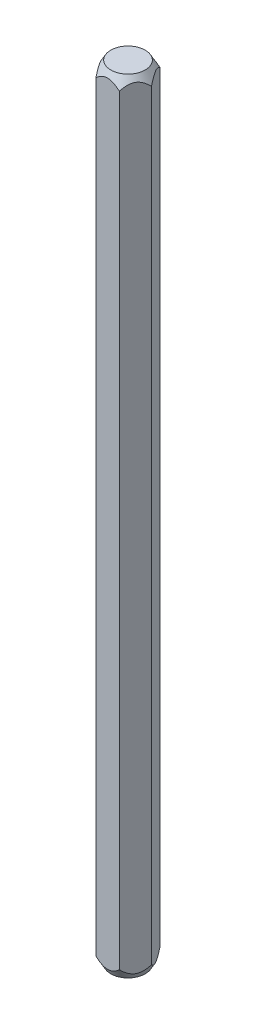
ISO-10303-21;
HEADER;
FILE_DESCRIPTION(('STEP AP214'),'2;1');
FILE_NAME('part.step','',(''),(''),'','','');
FILE_SCHEMA(('AUTOMOTIVE_DESIGN { 1 0 10303 214 1 1 1 1 }'));
ENDSEC;
DATA;
#1=APPLICATION_CONTEXT('core data for automotive mechanical design processes');
#2=APPLICATION_PROTOCOL_DEFINITION('international standard','automotive_design',2000,#1);
#3=PRODUCT_CONTEXT('',#1,'mechanical');
#4=PRODUCT('Part','Part','',(#3));
#5=PRODUCT_RELATED_PRODUCT_CATEGORY('part','',(#4));
#6=PRODUCT_DEFINITION_FORMATION('','',#4);
#7=PRODUCT_DEFINITION_CONTEXT('part definition',#1,'design');
#8=PRODUCT_DEFINITION('design','',#6,#7);
#9=PRODUCT_DEFINITION_SHAPE('','',#8);
#10=(LENGTH_UNIT() NAMED_UNIT(*) SI_UNIT(.MILLI.,.METRE.));
#11=(NAMED_UNIT(*) PLANE_ANGLE_UNIT() SI_UNIT($,.RADIAN.));
#12=(NAMED_UNIT(*) SI_UNIT($,.STERADIAN.) SOLID_ANGLE_UNIT());
#13=UNCERTAINTY_MEASURE_WITH_UNIT(LENGTH_MEASURE(1.E-05),#10,'distance_accuracy_value','');
#14=(GEOMETRIC_REPRESENTATION_CONTEXT(3) GLOBAL_UNCERTAINTY_ASSIGNED_CONTEXT((#13)) GLOBAL_UNIT_ASSIGNED_CONTEXT((#10,
#11,#12)) REPRESENTATION_CONTEXT('',''));
#15=CARTESIAN_POINT('',(0.,0.,0.));
#16=DIRECTION('',(0.,0.,1.));
#17=DIRECTION('',(1.,0.,0.));
#18=AXIS2_PLACEMENT_3D('',#15,#16,#17);
#19=CARTESIAN_POINT('',(0.,-25.,0.));
#20=DIRECTION('',(0.,1.,0.));
#21=DIRECTION('',(0.,0.,1.));
#22=AXIS2_PLACEMENT_3D('',#19,#20,#21);
#23=PLANE('',#22);
#24=CARTESIAN_POINT('',(0.,-25.,0.));
#25=DIRECTION('',(0.,-1.,0.));
#26=DIRECTION('',(0.,0.,-1.));
#27=AXIS2_PLACEMENT_3D('',#24,#25,#26);
#28=CIRCLE('',#27,1.1);
#29=CARTESIAN_POINT('',(0.,-25.,-1.1));
#30=VERTEX_POINT('',#29);
#31=EDGE_CURVE('E211',#30,#30,#28,.T.);
#32=ORIENTED_EDGE('',*,*,#31,.T.);
#33=EDGE_LOOP('',(#32));
#34=FACE_BOUND('',#33,.T.);
#35=ADVANCED_FACE('F35',(#34),#23,.F.);
#36=CARTESIAN_POINT('',(0.,-24.3,0.));
#37=DIRECTION('',(0.,1.,0.));
#38=DIRECTION('',(0.,0.,1.));
#39=AXIS2_PLACEMENT_3D('',#36,#37,#38);
#40=CONICAL_SURFACE('',#39,1.5,0.519146114246527);
#41=ORIENTED_EDGE('',*,*,#31,.F.);
#42=EDGE_LOOP('',(#41));
#43=FACE_BOUND('',#42,.T.);
#44=CARTESIAN_POINT('',(-2.07253485495864,-22.6445054642753,1.29903810567668));
#45=CARTESIAN_POINT('',(-2.03538623793567,-22.6995854387625,1.29903810567668));
#46=CARTESIAN_POINT('',(-1.99804778135318,-22.7545379106194,1.29903810567668));
#47=CARTESIAN_POINT('',(-1.92291943767535,-22.8641377250613,1.29903810567668));
#48=CARTESIAN_POINT('',(-1.88512952568831,-22.9187850505755,1.29903810567668));
#49=CARTESIAN_POINT('',(-1.77082429318834,-23.0824095365471,1.29903810567668));
#50=CARTESIAN_POINT('',(-1.6935260653681,-23.190841663383,1.29903810567667));
#51=CARTESIAN_POINT('',(-1.53196552591618,-23.4111605751849,1.29903810567667));
#52=CARTESIAN_POINT('',(-1.44754976557091,-23.5229362538769,1.29903810567667));
#53=CARTESIAN_POINT('',(-1.31736248949666,-23.687707759074,1.29903810567667));
#54=CARTESIAN_POINT('',(-1.27339385596722,-23.7421251999243,1.29903810567667));
#55=CARTESIAN_POINT('',(-1.18394248532173,-23.8496971859777,1.29903810567667));
#56=CARTESIAN_POINT('',(-1.13845992720304,-23.9028518792159,1.29903810567667));
#57=CARTESIAN_POINT('',(-1.0460663037322,-24.0068956974134,1.29903810567667));
#58=CARTESIAN_POINT('',(-0.999175897510064,-24.0578030562562,1.29903810567667));
#59=CARTESIAN_POINT('',(-0.902905518082995,-24.1573290918742,1.29903810567667));
#60=CARTESIAN_POINT('',(-0.853523188312272,-24.2059455148546,1.29903810567667));
#61=CARTESIAN_POINT('',(-0.752132260774167,-24.2992068812944,1.29903810567666));
#62=CARTESIAN_POINT('',(-0.700159699118802,-24.3438905358105,1.29903810567666));
#63=CARTESIAN_POINT('',(-0.59219859081294,-24.42803583742,1.29903810567666));
#64=CARTESIAN_POINT('',(-0.536218911719424,-24.4675084969099,1.29903810567666));
#65=CARTESIAN_POINT('',(-0.433498084070144,-24.5295405301596,1.29903810567666));
#66=CARTESIAN_POINT('',(-0.387849628266959,-24.5538748512374,1.29903810567666));
#67=CARTESIAN_POINT('',(-0.293526604004851,-24.5957302033474,1.29903810567666));
#68=CARTESIAN_POINT('',(-0.244858958002789,-24.613266197404,1.29903810567666));
#69=CARTESIAN_POINT('',(-0.153193150401338,-24.6370694717298,1.29903810567666));
#70=CARTESIAN_POINT('',(-0.110559843935742,-24.6447054155175,1.29903810567666));
#71=CARTESIAN_POINT('',(-0.0245950358367228,-24.6525133256309,1.29903810567666));
#72=CARTESIAN_POINT('',(0.0187362836021545,-24.6526872090989,1.29903810567666));
#73=CARTESIAN_POINT('',(0.104675897111497,-24.6455528412023,1.29903810567666));
#74=CARTESIAN_POINT('',(0.147285340581522,-24.6382579036111,1.29903810567666));
#75=CARTESIAN_POINT('',(0.230844394471178,-24.6172064684648,1.29903810567665));
#76=CARTESIAN_POINT('',(0.271792683893707,-24.6034449338227,1.29903810567665));
#77=CARTESIAN_POINT('',(0.379155683060809,-24.5596243102184,1.29903810567665));
#78=CARTESIAN_POINT('',(0.443632811839528,-24.524872986136,1.29903810567665));
#79=CARTESIAN_POINT('',(0.53609349528473,-24.4662230265959,1.29903810567665));
#80=CARTESIAN_POINT('',(0.566280834868065,-24.4455205799594,1.29903810567665));
#81=CARTESIAN_POINT('',(0.62539579604866,-24.4023888180353,1.29903810567665));
#82=CARTESIAN_POINT('',(0.654323878891216,-24.3799601435129,1.29903810567665));
#83=CARTESIAN_POINT('',(0.73164626055736,-24.3170177665695,1.29903810567665));
#84=CARTESIAN_POINT('',(0.778952826746308,-24.2751785470326,1.29903810567665));
#85=CARTESIAN_POINT('',(0.871034974400621,-24.1887832099594,1.29903810567665));
#86=CARTESIAN_POINT('',(0.915808803866991,-24.1442252549995,1.29903810567665));
#87=CARTESIAN_POINT('',(1.0034519171813,-24.0530954920219,1.29903810567665));
#88=CARTESIAN_POINT('',(1.04631674732251,-24.0065194285746,1.29903810567665));
#89=CARTESIAN_POINT('',(1.13045799987154,-23.9119490096584,1.29903810567665));
#90=CARTESIAN_POINT('',(1.17173414809037,-23.8639544118707,1.29903810567664));
#91=CARTESIAN_POINT('',(1.29402411346603,-23.7179577797709,1.29903810567664));
#92=CARTESIAN_POINT('',(1.37311876688962,-23.6183520364851,1.29903810567664));
#93=CARTESIAN_POINT('',(1.52779498622432,-23.4166840738683,1.29903810567664));
#94=CARTESIAN_POINT('',(1.60338079775172,-23.3146250626919,1.29903810567664));
#95=CARTESIAN_POINT('',(1.74551356738805,-23.1179594614914,1.29903810567664));
#96=CARTESIAN_POINT('',(1.81226533710323,-23.0235002712326,1.29903810567664));
#97=CARTESIAN_POINT('',(1.94369038410247,-22.8343046189558,1.29903810567664));
#98=CARTESIAN_POINT('',(2.00837631113091,-22.739576959479,1.29903810567664));
#99=CARTESIAN_POINT('',(2.07253485495868,-22.6445054642753,1.29903810567664));
#100=B_SPLINE_CURVE_WITH_KNOTS('',3,(#44,#45,#46,#47,#48,#49,#50,#51,#52,#53,#54,#55,#56,#57,
#58,#59,#60,#61,#62,#63,#64,#65,#66,#67,#68,#69,#70,#71,#72,#73,#74,#75,#76,#77,#78,#79,#80,#81,
#82,#83,#84,#85,#86,#87,#88,#89,#90,#91,#92,#93,#94,#95,#96,#97,#98,#99),.UNSPECIFIED.,.F.,.F.,
(4,2,2,2,2,2,2,2,2,2,2,2,2,2,2,2,2,2,2,2,2,2,2,2,2,2,2,4),(0.,0.199309941791665,
0.398630924034157,0.798094667911542,1.21820476163974,1.42806663426301,1.63790378160688,
1.84548111764697,2.05325857539453,2.25868516950043,2.46367043823924,2.6184799554092,
2.77294677782484,2.90229727841163,3.03161454624823,3.16070169633709,3.28988956459301,
3.50827500154843,3.61806680102765,3.72781804122222,3.91711654272997,4.10654442762105,
4.29639328838323,4.48627476936936,4.86771182519662,5.24867463357983,5.59565170158738,
5.93975000862931),.UNSPECIFIED.);
#101=CARTESIAN_POINT('',(-0.749999999999994,-24.3,1.29903810567666));
#102=VERTEX_POINT('',#101);
#103=CARTESIAN_POINT('',(0.750000000000015,-24.3,1.29903810567665));
#104=VERTEX_POINT('',#103);
#105=EDGE_CURVE('E205',#102,#104,#100,.T.);
#106=ORIENTED_EDGE('',*,*,#105,.F.);
#107=CARTESIAN_POINT('',(-1.50011427265704,-24.2998,-0.000197926047904945));
#108=CARTESIAN_POINT('',(-1.48445603297541,-24.327174757968,0.0269229406377818));
#109=CARTESIAN_POINT('',(-1.46848195449817,-24.3538800893295,0.0545908561644444));
#110=CARTESIAN_POINT('',(-1.43569548405084,-24.4055169111973,0.111378688780077));
#111=CARTESIAN_POINT('',(-1.41887901814408,-24.4304380044115,0.140505662134338));
#112=CARTESIAN_POINT('',(-1.38391500160077,-24.4783836425917,0.201065115224024));
#113=CARTESIAN_POINT('',(-1.36574408969252,-24.5013411744891,0.232538057868973));
#114=CARTESIAN_POINT('',(-1.32841093508815,-24.5436117266531,0.297200978450562));
#115=CARTESIAN_POINT('',(-1.30925105807725,-24.5629329732754,0.330386858900204));
#116=CARTESIAN_POINT('',(-1.26838798330661,-24.5980525589006,0.401163780556439));
#117=CARTESIAN_POINT('',(-1.24660186054835,-24.6134770395848,0.438898452073686));
#118=CARTESIAN_POINT('',(-1.20221357157386,-24.6369483088712,0.515781223838545));
#119=CARTESIAN_POINT('',(-1.17961959829794,-24.6450547788082,0.554915133497288));
#120=CARTESIAN_POINT('',(-1.13384224962676,-24.6528895799723,0.634203827231579));
#121=CARTESIAN_POINT('',(-1.11065535633217,-24.6525397632328,0.674364704487471));
#122=CARTESIAN_POINT('',(-1.06467286203397,-24.6433215388631,0.754008720870708));
#123=CARTESIAN_POINT('',(-1.04187839232794,-24.6344317002164,0.793489900533146));
#124=CARTESIAN_POINT('',(-0.991146983129713,-24.6060006684914,0.881359278804033));
#125=CARTESIAN_POINT('',(-0.963537845666472,-24.5841886627298,0.92917970764352));
#126=CARTESIAN_POINT('',(-0.910253599849041,-24.5323504473517,1.0214707286423));
#127=CARTESIAN_POINT('',(-0.884588776237871,-24.5022839857869,1.06592350710414));
#128=CARTESIAN_POINT('',(-0.840391512775697,-24.443815750008,1.14247541297613));
#129=CARTESIAN_POINT('',(-0.821509551399777,-24.4164389030966,1.17517992942577));
#130=CARTESIAN_POINT('',(-0.784926482622607,-24.3595575952382,1.23854366324462));
#131=CARTESIAN_POINT('',(-0.767213792789505,-24.3300831132095,1.26922294197426));
#132=CARTESIAN_POINT('',(-0.749885727342727,-24.2997999999996,1.29923603172496));
#133=B_SPLINE_CURVE_WITH_KNOTS('',3,(#107,#108,#109,#110,#111,#112,#113,#114,#115,#116,#117,
#118,#119,#120,#121,#122,#123,#124,#125,#126,#127,#128,#129,#130,#131,#132),.UNSPECIFIED.,.F.,
.F.,(4,2,2,2,2,2,2,2,2,2,2,2,4),(0.,0.124825594013029,0.250327656131253,0.379126359053951,
0.507630083264508,0.645790755097725,0.782814215772803,0.921104445712337,1.05974262128002,
1.23684404007381,1.41482490290692,1.5546504669262,1.69277279754433),.UNSPECIFIED.);
#134=CARTESIAN_POINT('',(-1.5,-24.3,0.));
#135=VERTEX_POINT('',#134);
#136=EDGE_CURVE('E207',#135,#102,#133,.T.);
#137=ORIENTED_EDGE('',*,*,#136,.F.);
#138=CARTESIAN_POINT('',(-0.749885727342744,-24.2997999999996,-1.29923603172495));
#139=CARTESIAN_POINT('',(-0.765543967024381,-24.3271747579676,-1.27211516503926));
#140=CARTESIAN_POINT('',(-0.781518045501614,-24.3538800893291,-1.2444472495126));
#141=CARTESIAN_POINT('',(-0.814304515948942,-24.405516911197,-1.18765941689697));
#142=CARTESIAN_POINT('',(-0.831120981855702,-24.4304380044111,-1.15853244354271));
#143=CARTESIAN_POINT('',(-0.866084998399005,-24.4783836425914,-1.09797299045303));
#144=CARTESIAN_POINT('',(-0.884255910307254,-24.5013411744888,-1.06650004780809));
#145=CARTESIAN_POINT('',(-0.921589064911617,-24.5436117266528,-1.00183712722651));
#146=CARTESIAN_POINT('',(-0.94074894192251,-24.5629329732752,-0.968651246776868));
#147=CARTESIAN_POINT('',(-0.981612016693148,-24.5980525589004,-0.897874325120636));
#148=CARTESIAN_POINT('',(-1.00339813945141,-24.6134770395847,-0.860139653603387));
#149=CARTESIAN_POINT('',(-1.0477864284259,-24.6369483088711,-0.783256881838522));
#150=CARTESIAN_POINT('',(-1.07038040170182,-24.6450547788082,-0.744122972179774));
#151=CARTESIAN_POINT('',(-1.11615775037302,-24.6528895799723,-0.664834278445467));
#152=CARTESIAN_POINT('',(-1.1393446436676,-24.6525397632328,-0.624673401189564));
#153=CARTESIAN_POINT('',(-1.18532713796582,-24.6433215388632,-0.545029384806302));
#154=CARTESIAN_POINT('',(-1.20812160767186,-24.6344317002165,-0.50554820514385));
#155=CARTESIAN_POINT('',(-1.25885301687008,-24.6060006684915,-0.417678826872974));
#156=CARTESIAN_POINT('',(-1.28646215433331,-24.58418866273,-0.369858398033512));
#157=CARTESIAN_POINT('',(-1.33974640015071,-24.532350447352,-0.277567377034775));
#158=CARTESIAN_POINT('',(-1.36541122376187,-24.5022839857872,-0.233114598572955));
#159=CARTESIAN_POINT('',(-1.40960848722404,-24.4438157500083,-0.156562692700968));
#160=CARTESIAN_POINT('',(-1.42849044859997,-24.4164389030969,-0.123858176251308));
#161=CARTESIAN_POINT('',(-1.46507351737715,-24.3595575952386,-0.0604944424324382));
#162=CARTESIAN_POINT('',(-1.48278620721026,-24.3300831132099,-0.0298151637027841));
#163=CARTESIAN_POINT('',(-1.50011427265704,-24.2998,0.000197926047925716));
#164=B_SPLINE_CURVE_WITH_KNOTS('',3,(#138,#139,#140,#141,#142,#143,#144,#145,#146,#147,#148,
#149,#150,#151,#152,#153,#154,#155,#156,#157,#158,#159,#160,#161,#162,#163),.UNSPECIFIED.,.F.,
.F.,(4,2,2,2,2,2,2,2,2,2,2,2,4),(0.,0.124825594013047,0.250327656131286,0.379126359054,
0.507630083264569,0.645790755097817,0.782814215772925,0.921104445712495,1.05974262128021,
1.23684404007388,1.41482490290687,1.55465046692618,1.69277279754433),.UNSPECIFIED.);
#165=CARTESIAN_POINT('',(-0.750000000000003,-24.3,-1.29903810567666));
#166=VERTEX_POINT('',#165);
#167=EDGE_CURVE('E92',#166,#135,#164,.T.);
#168=ORIENTED_EDGE('',*,*,#167,.F.);
#169=CARTESIAN_POINT('',(2.07253485495865,-22.6445054642753,-1.29903810567666));
#170=CARTESIAN_POINT('',(2.03538623793567,-22.6995854387625,-1.29903810567666));
#171=CARTESIAN_POINT('',(1.99804778135319,-22.7545379106194,-1.29903810567666));
#172=CARTESIAN_POINT('',(1.92291943767536,-22.8641377250613,-1.29903810567666));
#173=CARTESIAN_POINT('',(1.88512952568832,-22.9187850505755,-1.29903810567666));
#174=CARTESIAN_POINT('',(1.77082429318835,-23.0824095365471,-1.29903810567666));
#175=CARTESIAN_POINT('',(1.69352606536811,-23.190841663383,-1.29903810567666));
#176=CARTESIAN_POINT('',(1.53196552591619,-23.4111605751849,-1.29903810567666));
#177=CARTESIAN_POINT('',(1.44754976557092,-23.5229362538769,-1.29903810567666));
#178=CARTESIAN_POINT('',(1.31736248949667,-23.687707759074,-1.29903810567666));
#179=CARTESIAN_POINT('',(1.27339385596723,-23.7421251999243,-1.29903810567666));
#180=CARTESIAN_POINT('',(1.18394248532174,-23.8496971859777,-1.29903810567666));
#181=CARTESIAN_POINT('',(1.13845992720305,-23.9028518792159,-1.29903810567666));
#182=CARTESIAN_POINT('',(1.0460663037322,-24.0068956974134,-1.29903810567666));
#183=CARTESIAN_POINT('',(0.999175897510073,-24.0578030562562,-1.29903810567666));
#184=CARTESIAN_POINT('',(0.902905518083004,-24.1573290918742,-1.29903810567666));
#185=CARTESIAN_POINT('',(0.853523188312281,-24.2059455148546,-1.29903810567666));
#186=CARTESIAN_POINT('',(0.752132260774175,-24.2992068812944,-1.29903810567666));
#187=CARTESIAN_POINT('',(0.70015969911881,-24.3438905358105,-1.29903810567666));
#188=CARTESIAN_POINT('',(0.592198590812948,-24.42803583742,-1.29903810567666));
#189=CARTESIAN_POINT('',(0.536218911719433,-24.4675084969099,-1.29903810567666));
#190=CARTESIAN_POINT('',(0.433498084070153,-24.5295405301596,-1.29903810567666));
#191=CARTESIAN_POINT('',(0.387849628266967,-24.5538748512374,-1.29903810567666));
#192=CARTESIAN_POINT('',(0.29352660400486,-24.5957302033474,-1.29903810567666));
#193=CARTESIAN_POINT('',(0.244858958002798,-24.613266197404,-1.29903810567666));
#194=CARTESIAN_POINT('',(0.153193150401347,-24.6370694717298,-1.29903810567666));
#195=CARTESIAN_POINT('',(0.110559843935751,-24.6447054155175,-1.29903810567666));
#196=CARTESIAN_POINT('',(0.0245950358367311,-24.6525133256309,-1.29903810567666));
#197=CARTESIAN_POINT('',(-0.0187362836021461,-24.6526872090989,-1.29903810567666));
#198=CARTESIAN_POINT('',(-0.104675897111489,-24.6455528412023,-1.29903810567666));
#199=CARTESIAN_POINT('',(-0.147285340581513,-24.6382579036111,-1.29903810567666));
#200=CARTESIAN_POINT('',(-0.230844394471169,-24.6172064684648,-1.29903810567666));
#201=CARTESIAN_POINT('',(-0.271792683893698,-24.6034449338227,-1.29903810567666));
#202=CARTESIAN_POINT('',(-0.3791556830608,-24.5596243102184,-1.29903810567666));
#203=CARTESIAN_POINT('',(-0.443632811839519,-24.524872986136,-1.29903810567666));
#204=CARTESIAN_POINT('',(-0.53609349528472,-24.4662230265959,-1.29903810567666));
#205=CARTESIAN_POINT('',(-0.566280834868054,-24.4455205799594,-1.29903810567666));
#206=CARTESIAN_POINT('',(-0.625395796048651,-24.4023888180353,-1.29903810567665));
#207=CARTESIAN_POINT('',(-0.654323878891209,-24.3799601435129,-1.29903810567665));
#208=CARTESIAN_POINT('',(-0.731646260557356,-24.3170177665695,-1.29903810567665));
#209=CARTESIAN_POINT('',(-0.778952826746304,-24.2751785470326,-1.29903810567665));
#210=CARTESIAN_POINT('',(-0.871034974400618,-24.1887832099594,-1.29903810567665));
#211=CARTESIAN_POINT('',(-0.915808803866988,-24.1442252549995,-1.29903810567665));
#212=CARTESIAN_POINT('',(-1.00345191718129,-24.0530954920219,-1.29903810567665));
#213=CARTESIAN_POINT('',(-1.04631674732251,-24.0065194285746,-1.29903810567665));
#214=CARTESIAN_POINT('',(-1.13045799987154,-23.9119490096584,-1.29903810567665));
#215=CARTESIAN_POINT('',(-1.17173414809037,-23.8639544118706,-1.29903810567665));
#216=CARTESIAN_POINT('',(-1.29402411346603,-23.7179577797709,-1.29903810567665));
#217=CARTESIAN_POINT('',(-1.37311876688962,-23.6183520364851,-1.29903810567665));
#218=CARTESIAN_POINT('',(-1.52779498622432,-23.4166840738683,-1.29903810567665));
#219=CARTESIAN_POINT('',(-1.60338079775172,-23.3146250626919,-1.29903810567665));
#220=CARTESIAN_POINT('',(-1.74551356738804,-23.1179594614914,-1.29903810567665));
#221=CARTESIAN_POINT('',(-1.81226533710322,-23.0235002712326,-1.29903810567665));
#222=CARTESIAN_POINT('',(-1.94369038410245,-22.8343046189558,-1.29903810567665));
#223=CARTESIAN_POINT('',(-2.00837631113089,-22.7395769594791,-1.29903810567665));
#224=CARTESIAN_POINT('',(-2.07253485495866,-22.6445054642753,-1.29903810567665));
#225=B_SPLINE_CURVE_WITH_KNOTS('',3,(#169,#170,#171,#172,#173,#174,#175,#176,#177,#178,#179,
#180,#181,#182,#183,#184,#185,#186,#187,#188,#189,#190,#191,#192,#193,#194,#195,#196,#197,#198,
#199,#200,#201,#202,#203,#204,#205,#206,#207,#208,#209,#210,#211,#212,#213,#214,#215,#216,#217,
#218,#219,#220,#221,#222,#223,#224),.UNSPECIFIED.,.F.,.F.,(4,2,2,2,2,2,2,2,2,2,2,2,2,2,2,2,2,2,
2,2,2,2,2,2,2,2,2,4),(0.,0.199309941791666,0.398630924034157,0.798094667911542,1.21820476163974,
1.42806663426301,1.63790378160688,1.84548111764697,2.05325857539453,2.25868516950043,
2.46367043823924,2.6184799554092,2.77294677782484,2.90229727841163,3.03161454624823,
3.16070169633709,3.28988956459301,3.50827500154843,3.61806680102765,3.72781804122222,
3.91711654272998,4.10654442762106,4.29639328838324,4.48627476936937,4.86771182519663,
5.24867463357984,5.59565170158737,5.93975000862928),.UNSPECIFIED.);
#226=CARTESIAN_POINT('',(0.750000000000003,-24.3,-1.29903810567666));
#227=VERTEX_POINT('',#226);
#228=EDGE_CURVE('E87',#227,#166,#225,.T.);
#229=ORIENTED_EDGE('',*,*,#228,.F.);
#230=CARTESIAN_POINT('',(1.50011427265704,-24.2998,0.000197926047915423));
#231=CARTESIAN_POINT('',(1.48445603297541,-24.327174757968,-0.0269229406377714));
#232=CARTESIAN_POINT('',(1.46848195449817,-24.3538800893295,-0.0545908561644341));
#233=CARTESIAN_POINT('',(1.43569548405084,-24.4055169111973,-0.111378688780067));
#234=CARTESIAN_POINT('',(1.41887901814408,-24.4304380044115,-0.140505662134329));
#235=CARTESIAN_POINT('',(1.38391500160077,-24.4783836425917,-0.201065115224014));
#236=CARTESIAN_POINT('',(1.36574408969252,-24.5013411744891,-0.232538057868963));
#237=CARTESIAN_POINT('',(1.32841093508815,-24.5436117266531,-0.297200978450553));
#238=CARTESIAN_POINT('',(1.30925105807726,-24.5629329732754,-0.330386858900195));
#239=CARTESIAN_POINT('',(1.26838798330662,-24.5980525589006,-0.40116378055643));
#240=CARTESIAN_POINT('',(1.24660186054835,-24.6134770395848,-0.438898452073677));
#241=CARTESIAN_POINT('',(1.20221357157387,-24.6369483088712,-0.515781223838537));
#242=CARTESIAN_POINT('',(1.17961959829795,-24.6450547788082,-0.55491513349728));
#243=CARTESIAN_POINT('',(1.13384224962676,-24.6528895799723,-0.634203827231572));
#244=CARTESIAN_POINT('',(1.11065535633218,-24.6525397632328,-0.674364704487464));
#245=CARTESIAN_POINT('',(1.06467286203397,-24.6433215388631,-0.754008720870701));
#246=CARTESIAN_POINT('',(1.04187839232794,-24.6344317002164,-0.793489900533139));
#247=CARTESIAN_POINT('',(0.991146983129719,-24.6060006684914,-0.881359278804028));
#248=CARTESIAN_POINT('',(0.963537845666477,-24.5841886627298,-0.929179707643515));
#249=CARTESIAN_POINT('',(0.910253599849047,-24.5323504473517,-1.02147072864229));
#250=CARTESIAN_POINT('',(0.884588776237878,-24.5022839857869,-1.06592350710413));
#251=CARTESIAN_POINT('',(0.840391512775705,-24.443815750008,-1.14247541297612));
#252=CARTESIAN_POINT('',(0.821509551399785,-24.4164389030966,-1.17517992942577));
#253=CARTESIAN_POINT('',(0.784926482622615,-24.3595575952382,-1.23854366324461));
#254=CARTESIAN_POINT('',(0.767213792789512,-24.3300831132095,-1.26922294197426));
#255=CARTESIAN_POINT('',(0.749885727342735,-24.2997999999996,-1.29923603172495));
#256=B_SPLINE_CURVE_WITH_KNOTS('',3,(#230,#231,#232,#233,#234,#235,#236,#237,#238,#239,#240,
#241,#242,#243,#244,#245,#246,#247,#248,#249,#250,#251,#252,#253,#254,#255),.UNSPECIFIED.,.F.,
.F.,(4,2,2,2,2,2,2,2,2,2,2,2,4),(0.,0.124825594013029,0.250327656131253,0.379126359053951,
0.507630083264508,0.645790755097725,0.782814215772803,0.921104445712338,1.05974262128002,
1.23684404007381,1.41482490290692,1.5546504669262,1.69277279754433),.UNSPECIFIED.);
#257=CARTESIAN_POINT('',(1.5,-24.3,0.));
#258=VERTEX_POINT('',#257);
#259=EDGE_CURVE('E90',#258,#227,#256,.T.);
#260=ORIENTED_EDGE('',*,*,#259,.F.);
#261=CARTESIAN_POINT('',(0.749885727342754,-24.2997999999996,1.29923603172494));
#262=CARTESIAN_POINT('',(0.76554396702439,-24.3271747579676,1.27211516503926));
#263=CARTESIAN_POINT('',(0.781518045501623,-24.3538800893291,1.2444472495126));
#264=CARTESIAN_POINT('',(0.814304515948952,-24.405516911197,1.18765941689697));
#265=CARTESIAN_POINT('',(0.831120981855712,-24.4304380044111,1.15853244354271));
#266=CARTESIAN_POINT('',(0.866084998399014,-24.4783836425914,1.09797299045303));
#267=CARTESIAN_POINT('',(0.884255910307263,-24.5013411744888,1.06650004780808));
#268=CARTESIAN_POINT('',(0.921589064911627,-24.5436117266528,1.0018371272265));
#269=CARTESIAN_POINT('',(0.940748941922521,-24.5629329732752,0.96865124677686));
#270=CARTESIAN_POINT('',(0.98161201669316,-24.5980525589004,0.897874325120626));
#271=CARTESIAN_POINT('',(1.00339813945143,-24.6134770395847,0.860139653603378));
#272=CARTESIAN_POINT('',(1.04778642842591,-24.6369483088711,0.783256881838513));
#273=CARTESIAN_POINT('',(1.07038040170183,-24.6450547788082,0.744122972179765));
#274=CARTESIAN_POINT('',(1.11615775037303,-24.6528895799723,0.664834278445459));
#275=CARTESIAN_POINT('',(1.13934464366762,-24.6525397632328,0.624673401189556));
#276=CARTESIAN_POINT('',(1.18532713796583,-24.6433215388632,0.545029384806295));
#277=CARTESIAN_POINT('',(1.20812160767187,-24.6344317002165,0.505548205143843));
#278=CARTESIAN_POINT('',(1.25885301687009,-24.6060006684915,0.417678826872967));
#279=CARTESIAN_POINT('',(1.28646215433332,-24.58418866273,0.369858398033504));
#280=CARTESIAN_POINT('',(1.33974640015072,-24.5323504473519,0.277567377034766));
#281=CARTESIAN_POINT('',(1.36541122376188,-24.5022839857872,0.233114598572946));
#282=CARTESIAN_POINT('',(1.40960848722405,-24.4438157500083,0.156562692700961));
#283=CARTESIAN_POINT('',(1.42849044859997,-24.4164389030969,0.123858176251304));
#284=CARTESIAN_POINT('',(1.46507351737715,-24.3595575952385,0.0604944424324407));
#285=CARTESIAN_POINT('',(1.48278620721026,-24.3300831132099,0.0298151637027909));
#286=CARTESIAN_POINT('',(1.50011427265704,-24.2998,-0.000197926047914988));
#287=B_SPLINE_CURVE_WITH_KNOTS('',3,(#261,#262,#263,#264,#265,#266,#267,#268,#269,#270,#271,
#272,#273,#274,#275,#276,#277,#278,#279,#280,#281,#282,#283,#284,#285,#286),.UNSPECIFIED.,.F.,
.F.,(4,2,2,2,2,2,2,2,2,2,2,2,4),(0.,0.124825594013047,0.250327656131283,0.379126359053997,
0.50763008326457,0.645790755097819,0.782814215772925,0.921104445712494,1.05974262128021,
1.23684404007389,1.41482490290687,1.55465046692617,1.6927727975443),.UNSPECIFIED.);
#288=EDGE_CURVE('E59',#104,#258,#287,.T.);
#289=ORIENTED_EDGE('',*,*,#288,.F.);
#290=EDGE_LOOP('',(#106,#137,#168,#229,#260,#289));
#291=FACE_BOUND('',#290,.T.);
#292=ADVANCED_FACE('F89',(#43,#291),#40,.T.);
#293=CARTESIAN_POINT('',(0.750000000000015,25.,1.29903810567665));
#294=DIRECTION('',(-0.866025403784442,0.,-0.499999999999995));
#295=DIRECTION('',(-0.499999999999995,0.,0.866025403784441));
#296=AXIS2_PLACEMENT_3D('',#293,#294,#295);
#297=PLANE('',#296);
#298=DIRECTION('',(0.,-1.,0.));
#299=VECTOR('',#298,1.);
#300=CARTESIAN_POINT('',(1.5,25.,0.));
#301=LINE('',#300,#299);
#302=CARTESIAN_POINT('',(1.5,24.3,0.));
#303=VERTEX_POINT('',#302);
#304=EDGE_CURVE('E11',#303,#258,#301,.T.);
#305=ORIENTED_EDGE('',*,*,#304,.F.);
#306=CARTESIAN_POINT('',(1.50011427265704,24.2998,-0.000197926047909928));
#307=CARTESIAN_POINT('',(1.4844560329754,24.327174757968,0.0269229406377773));
#308=CARTESIAN_POINT('',(1.46848195449817,24.3538800893295,0.0545908561644404));
#309=CARTESIAN_POINT('',(1.43569548405084,24.4055169111973,0.111378688780074));
#310=CARTESIAN_POINT('',(1.41887901814408,24.4304380044115,0.140505662134336));
#311=CARTESIAN_POINT('',(1.38391500160077,24.4783836425917,0.201065115224022));
#312=CARTESIAN_POINT('',(1.36574408969252,24.5013411744891,0.232538057868972));
#313=CARTESIAN_POINT('',(1.32841093508815,24.5436117266531,0.297200978450562));
#314=CARTESIAN_POINT('',(1.30925105807725,24.5629329732754,0.330386858900204));
#315=CARTESIAN_POINT('',(1.26838798330662,24.5980525589006,0.401163780556439));
#316=CARTESIAN_POINT('',(1.24660186054835,24.6134770395848,0.438898452073686));
#317=CARTESIAN_POINT('',(1.20221357157387,24.6369483088712,0.515781223838546));
#318=CARTESIAN_POINT('',(1.17961959829795,24.6450547788082,0.554915133497289));
#319=CARTESIAN_POINT('',(1.13384224962676,24.6528895799723,0.634203827231579));
#320=CARTESIAN_POINT('',(1.11065535633218,24.6525397632328,0.674364704487471));
#321=CARTESIAN_POINT('',(1.06467286203398,24.6433215388631,0.754008720870707));
#322=CARTESIAN_POINT('',(1.04187839232795,24.6344317002164,0.793489900533145));
#323=CARTESIAN_POINT('',(0.991146983129724,24.6060006684914,0.881359278804033));
#324=CARTESIAN_POINT('',(0.963537845666483,24.5841886627298,0.929179707643521));
#325=CARTESIAN_POINT('',(0.910253599849052,24.5323504473517,1.0214707286423));
#326=CARTESIAN_POINT('',(0.884588776237883,24.5022839857869,1.06592350710414));
#327=CARTESIAN_POINT('',(0.840391512775713,24.443815750008,1.14247541297613));
#328=CARTESIAN_POINT('',(0.821509551399796,24.4164389030966,1.17517992942577));
#329=CARTESIAN_POINT('',(0.784926482622631,24.3595575952382,1.23854366324461));
#330=CARTESIAN_POINT('',(0.767213792789532,24.3300831132095,1.26922294197424));
#331=CARTESIAN_POINT('',(0.749885727342757,24.2997999999996,1.29923603172494));
#332=B_SPLINE_CURVE_WITH_KNOTS('',3,(#306,#307,#308,#309,#310,#311,#312,#313,#314,#315,#316,
#317,#318,#319,#320,#321,#322,#323,#324,#325,#326,#327,#328,#329,#330,#331),.UNSPECIFIED.,.F.,
.F.,(4,2,2,2,2,2,2,2,2,2,2,2,4),(0.,0.124825594013029,0.250327656131255,0.379126359053953,
0.507630083264508,0.645790755097724,0.7828142157728,0.921104445712332,1.05974262128002,
1.23684404007381,1.41482490290692,1.55465046692619,1.69277279754429),.UNSPECIFIED.);
#333=CARTESIAN_POINT('',(0.750000000000015,24.3,1.29903810567665));
#334=VERTEX_POINT('',#333);
#335=EDGE_CURVE('E119',#303,#334,#332,.T.);
#336=ORIENTED_EDGE('',*,*,#335,.T.);
#337=DIRECTION('',(0.,-1.,0.));
#338=VECTOR('',#337,1.);
#339=CARTESIAN_POINT('',(0.750000000000015,25.,1.29903810567665));
#340=LINE('',#339,#338);
#341=EDGE_CURVE('E116',#334,#104,#340,.T.);
#342=ORIENTED_EDGE('',*,*,#341,.T.);
#343=ORIENTED_EDGE('',*,*,#288,.T.);
#344=EDGE_LOOP('',(#305,#336,#342,#343));
#345=FACE_BOUND('',#344,.T.);
#346=ADVANCED_FACE('F37',(#345),#297,.F.);
#347=CARTESIAN_POINT('',(1.5,25.,0.));
#348=DIRECTION('',(-0.866025403784438,0.,0.500000000000001));
#349=DIRECTION('',(0.500000000000001,0.,0.866025403784438));
#350=AXIS2_PLACEMENT_3D('',#347,#348,#349);
#351=PLANE('',#350);
#352=DIRECTION('',(0.,-1.,0.));
#353=VECTOR('',#352,1.);
#354=CARTESIAN_POINT('',(0.749999999999997,25.,-1.29903810567666));
#355=LINE('',#354,#353);
#356=CARTESIAN_POINT('',(0.749999999999997,24.3,-1.29903810567666));
#357=VERTEX_POINT('',#356);
#358=EDGE_CURVE('E44',#357,#227,#355,.T.);
#359=ORIENTED_EDGE('',*,*,#358,.F.);
#360=CARTESIAN_POINT('',(0.749885727342739,24.2997999999996,-1.29923603172495));
#361=CARTESIAN_POINT('',(0.765543967024375,24.3271747579676,-1.27211516503926));
#362=CARTESIAN_POINT('',(0.781518045501608,24.3538800893291,-1.2444472495126));
#363=CARTESIAN_POINT('',(0.814304515948937,24.405516911197,-1.18765941689697));
#364=CARTESIAN_POINT('',(0.831120981855697,24.4304380044111,-1.15853244354271));
#365=CARTESIAN_POINT('',(0.866084998399,24.4783836425914,-1.09797299045303));
#366=CARTESIAN_POINT('',(0.88425591030725,24.5013411744888,-1.06650004780809));
#367=CARTESIAN_POINT('',(0.921589064911614,24.5436117266528,-1.00183712722651));
#368=CARTESIAN_POINT('',(0.940748941922507,24.5629329732752,-0.968651246776868));
#369=CARTESIAN_POINT('',(0.981612016693146,24.5980525589004,-0.897874325120636));
#370=CARTESIAN_POINT('',(1.00339813945141,24.6134770395847,-0.860139653603388));
#371=CARTESIAN_POINT('',(1.0477864284259,24.6369483088711,-0.783256881838523));
#372=CARTESIAN_POINT('',(1.07038040170182,24.6450547788082,-0.744122972179775));
#373=CARTESIAN_POINT('',(1.11615775037302,24.6528895799723,-0.664834278445469));
#374=CARTESIAN_POINT('',(1.1393446436676,24.6525397632328,-0.624673401189567));
#375=CARTESIAN_POINT('',(1.18532713796582,24.6433215388632,-0.545029384806306));
#376=CARTESIAN_POINT('',(1.20812160767186,24.6344317002165,-0.505548205143855));
#377=CARTESIAN_POINT('',(1.25885301687008,24.6060006684915,-0.41767882687298));
#378=CARTESIAN_POINT('',(1.2864621543333,24.58418866273,-0.369858398033518));
#379=CARTESIAN_POINT('',(1.33974640015071,24.5323504473519,-0.277567377034781));
#380=CARTESIAN_POINT('',(1.36541122376187,24.5022839857872,-0.233114598572963));
#381=CARTESIAN_POINT('',(1.40960848722404,24.4438157500083,-0.156562692700975));
#382=CARTESIAN_POINT('',(1.42849044859997,24.4164389030969,-0.123858176251316));
#383=CARTESIAN_POINT('',(1.46507351737715,24.3595575952385,-0.0604944424324484));
#384=CARTESIAN_POINT('',(1.48278620721026,24.3300831132099,-0.0298151637027971));
#385=CARTESIAN_POINT('',(1.50011427265704,24.2998,0.000197926047909344));
#386=B_SPLINE_CURVE_WITH_KNOTS('',3,(#360,#361,#362,#363,#364,#365,#366,#367,#368,#369,#370,
#371,#372,#373,#374,#375,#376,#377,#378,#379,#380,#381,#382,#383,#384,#385),.UNSPECIFIED.,.F.,
.F.,(4,2,2,2,2,2,2,2,2,2,2,2,4),(0.,0.124825594013048,0.250327656131287,0.379126359054002,
0.507630083264572,0.64579075509782,0.782814215772928,0.921104445712496,1.05974262128022,
1.23684404007388,1.41482490290687,1.55465046692618,1.69277279754432),.UNSPECIFIED.);
#387=EDGE_CURVE('E127',#357,#303,#386,.T.);
#388=ORIENTED_EDGE('',*,*,#387,.T.);
#389=ORIENTED_EDGE('',*,*,#304,.T.);
#390=ORIENTED_EDGE('',*,*,#259,.T.);
#391=EDGE_LOOP('',(#359,#388,#389,#390));
#392=FACE_BOUND('',#391,.T.);
#393=ADVANCED_FACE('F100',(#392),#351,.F.);
#394=CARTESIAN_POINT('',(0.749999999999997,25.,-1.29903810567666));
#395=DIRECTION('',(0.,0.,1.));
#396=DIRECTION('',(1.,0.,0.));
#397=AXIS2_PLACEMENT_3D('',#394,#395,#396);
#398=PLANE('',#397);
#399=DIRECTION('',(0.,-1.,0.));
#400=VECTOR('',#399,1.);
#401=CARTESIAN_POINT('',(-0.750000000000006,25.,-1.29903810567665));
#402=LINE('',#401,#400);
#403=CARTESIAN_POINT('',(-0.750000000000006,24.3,-1.29903810567665));
#404=VERTEX_POINT('',#403);
#405=EDGE_CURVE('E107',#404,#166,#402,.T.);
#406=ORIENTED_EDGE('',*,*,#405,.F.);
#407=CARTESIAN_POINT('',(-2.07253485495864,22.6445054642753,-1.29903810567665));
#408=CARTESIAN_POINT('',(-2.03538623793567,22.6995854387625,-1.29903810567665));
#409=CARTESIAN_POINT('',(-1.99804778135319,22.7545379106194,-1.29903810567665));
#410=CARTESIAN_POINT('',(-1.92291943767536,22.8641377250613,-1.29903810567665));
#411=CARTESIAN_POINT('',(-1.88512952568831,22.9187850505755,-1.29903810567665));
#412=CARTESIAN_POINT('',(-1.77082429318835,23.0824095365471,-1.29903810567665));
#413=CARTESIAN_POINT('',(-1.69352606536811,23.190841663383,-1.29903810567665));
#414=CARTESIAN_POINT('',(-1.5319655259162,23.4111605751849,-1.29903810567665));
#415=CARTESIAN_POINT('',(-1.44754976557092,23.5229362538768,-1.29903810567665));
#416=CARTESIAN_POINT('',(-1.31736248949667,23.687707759074,-1.29903810567665));
#417=CARTESIAN_POINT('',(-1.27339385596723,23.7421251999243,-1.29903810567665));
#418=CARTESIAN_POINT('',(-1.18394248532175,23.8496971859777,-1.29903810567665));
#419=CARTESIAN_POINT('',(-1.13845992720305,23.9028518792159,-1.29903810567665));
#420=CARTESIAN_POINT('',(-1.04606630373221,24.0068956974134,-1.29903810567665));
#421=CARTESIAN_POINT('',(-0.999175897510075,24.0578030562562,-1.29903810567665));
#422=CARTESIAN_POINT('',(-0.902905518083007,24.1573290918742,-1.29903810567665));
#423=CARTESIAN_POINT('',(-0.853523188312283,24.2059455148546,-1.29903810567665));
#424=CARTESIAN_POINT('',(-0.752132260774177,24.2992068812944,-1.29903810567665));
#425=CARTESIAN_POINT('',(-0.700159699118811,24.3438905358105,-1.29903810567665));
#426=CARTESIAN_POINT('',(-0.59219859081295,24.42803583742,-1.29903810567666));
#427=CARTESIAN_POINT('',(-0.536218911719435,24.4675084969099,-1.29903810567666));
#428=CARTESIAN_POINT('',(-0.433498084070156,24.5295405301596,-1.29903810567666));
#429=CARTESIAN_POINT('',(-0.38784962826697,24.5538748512374,-1.29903810567666));
#430=CARTESIAN_POINT('',(-0.293526604004863,24.5957302033474,-1.29903810567666));
#431=CARTESIAN_POINT('',(-0.244858958002802,24.613266197404,-1.29903810567666));
#432=CARTESIAN_POINT('',(-0.153193150401351,24.6370694717298,-1.29903810567666));
#433=CARTESIAN_POINT('',(-0.110559843935755,24.6447054155175,-1.29903810567666));
#434=CARTESIAN_POINT('',(-0.024595035836736,24.6525133256309,-1.29903810567666));
#435=CARTESIAN_POINT('',(0.0187362836021409,24.6526872090989,-1.29903810567666));
#436=CARTESIAN_POINT('',(0.104675897111482,24.6455528412023,-1.29903810567666));
#437=CARTESIAN_POINT('',(0.147285340581506,24.6382579036111,-1.29903810567666));
#438=CARTESIAN_POINT('',(0.230844394471161,24.6172064684648,-1.29903810567666));
#439=CARTESIAN_POINT('',(0.271792683893689,24.6034449338227,-1.29903810567666));
#440=CARTESIAN_POINT('',(0.379155683060791,24.5596243102184,-1.29903810567666));
#441=CARTESIAN_POINT('',(0.443632811839509,24.524872986136,-1.29903810567666));
#442=CARTESIAN_POINT('',(0.53609349528471,24.4662230265959,-1.29903810567666));
#443=CARTESIAN_POINT('',(0.566280834868044,24.4455205799594,-1.29903810567666));
#444=CARTESIAN_POINT('',(0.62539579604864,24.4023888180353,-1.29903810567666));
#445=CARTESIAN_POINT('',(0.654323878891198,24.3799601435129,-1.29903810567666));
#446=CARTESIAN_POINT('',(0.731646260557342,24.3170177665695,-1.29903810567666));
#447=CARTESIAN_POINT('',(0.778952826746287,24.2751785470326,-1.29903810567666));
#448=CARTESIAN_POINT('',(0.871034974400599,24.1887832099594,-1.29903810567666));
#449=CARTESIAN_POINT('',(0.91580880386697,24.1442252549995,-1.29903810567666));
#450=CARTESIAN_POINT('',(1.00345191718128,24.0530954920219,-1.29903810567666));
#451=CARTESIAN_POINT('',(1.04631674732249,24.0065194285746,-1.29903810567666));
#452=CARTESIAN_POINT('',(1.13045799987153,23.9119490096584,-1.29903810567666));
#453=CARTESIAN_POINT('',(1.17173414809035,23.8639544118706,-1.29903810567666));
#454=CARTESIAN_POINT('',(1.29402411346601,23.7179577797709,-1.29903810567666));
#455=CARTESIAN_POINT('',(1.37311876688961,23.6183520364851,-1.29903810567666));
#456=CARTESIAN_POINT('',(1.5277949862243,23.4166840738682,-1.29903810567666));
#457=CARTESIAN_POINT('',(1.6033807977517,23.3146250626919,-1.29903810567666));
#458=CARTESIAN_POINT('',(1.74551356738803,23.1179594614914,-1.29903810567666));
#459=CARTESIAN_POINT('',(1.8122653371032,23.0235002712326,-1.29903810567666));
#460=CARTESIAN_POINT('',(1.94369038410243,22.8343046189558,-1.29903810567666));
#461=CARTESIAN_POINT('',(2.00837631113087,22.7395769594791,-1.29903810567666));
#462=CARTESIAN_POINT('',(2.07253485495863,22.6445054642753,-1.29903810567666));
#463=B_SPLINE_CURVE_WITH_KNOTS('',3,(#407,#408,#409,#410,#411,#412,#413,#414,#415,#416,#417,
#418,#419,#420,#421,#422,#423,#424,#425,#426,#427,#428,#429,#430,#431,#432,#433,#434,#435,#436,
#437,#438,#439,#440,#441,#442,#443,#444,#445,#446,#447,#448,#449,#450,#451,#452,#453,#454,#455,
#456,#457,#458,#459,#460,#461,#462),.UNSPECIFIED.,.F.,.F.,(4,2,2,2,2,2,2,2,2,2,2,2,2,2,2,2,2,2,
2,2,2,2,2,2,2,2,2,4),(0.,0.199309941791661,0.398630924034153,0.798094667911537,1.21820476163973,
1.42806663426301,1.63790378160688,1.84548111764697,2.05325857539453,2.25868516950043,
2.46367043823924,2.6184799554092,2.77294677782484,2.90229727841163,3.03161454624822,
3.16070169633708,3.289889564593,3.50827500154842,3.61806680102764,3.72781804122221,
3.91711654272996,4.10654442762104,4.29639328838323,4.48627476936936,4.86771182519661,
5.24867463357983,5.59565170158735,5.93975000862926),.UNSPECIFIED.);
#464=EDGE_CURVE('E106',#404,#357,#463,.T.);
#465=ORIENTED_EDGE('',*,*,#464,.T.);
#466=ORIENTED_EDGE('',*,*,#358,.T.);
#467=ORIENTED_EDGE('',*,*,#228,.T.);
#468=EDGE_LOOP('',(#406,#465,#466,#467));
#469=FACE_BOUND('',#468,.T.);
#470=ADVANCED_FACE('F105',(#469),#398,.F.);
#471=CARTESIAN_POINT('',(-0.750000000000006,25.,-1.29903810567665));
#472=DIRECTION('',(0.866025403784442,0.,0.499999999999995));
#473=DIRECTION('',(0.499999999999995,0.,-0.866025403784442));
#474=AXIS2_PLACEMENT_3D('',#471,#472,#473);
#475=PLANE('',#474);
#476=DIRECTION('',(0.,-1.,0.));
#477=VECTOR('',#476,1.);
#478=CARTESIAN_POINT('',(-1.5,25.,0.));
#479=LINE('',#478,#477);
#480=CARTESIAN_POINT('',(-1.5,24.3,0.));
#481=VERTEX_POINT('',#480);
#482=EDGE_CURVE('E108',#481,#135,#479,.T.);
#483=ORIENTED_EDGE('',*,*,#482,.F.);
#484=CARTESIAN_POINT('',(-1.50011427265704,24.2998,0.000197926047920883));
#485=CARTESIAN_POINT('',(-1.4844560329754,24.327174757968,-0.0269229406377675));
#486=CARTESIAN_POINT('',(-1.46848195449817,24.3538800893295,-0.0545908561644314));
#487=CARTESIAN_POINT('',(-1.43569548405084,24.4055169111973,-0.111378688780065));
#488=CARTESIAN_POINT('',(-1.41887901814408,24.4304380044115,-0.140505662134326));
#489=CARTESIAN_POINT('',(-1.38391500160077,24.4783836425917,-0.201065115224011));
#490=CARTESIAN_POINT('',(-1.36574408969252,24.5013411744891,-0.232538057868961));
#491=CARTESIAN_POINT('',(-1.32841093508815,24.5436117266531,-0.29720097845055));
#492=CARTESIAN_POINT('',(-1.30925105807726,24.5629329732754,-0.330386858900191));
#493=CARTESIAN_POINT('',(-1.26838798330662,24.5980525589006,-0.401163780556425));
#494=CARTESIAN_POINT('',(-1.24660186054835,24.6134770395848,-0.438898452073673));
#495=CARTESIAN_POINT('',(-1.20221357157387,24.6369483088712,-0.515781223838532));
#496=CARTESIAN_POINT('',(-1.17961959829795,24.6450547788082,-0.554915133497275));
#497=CARTESIAN_POINT('',(-1.13384224962676,24.6528895799723,-0.634203827231565));
#498=CARTESIAN_POINT('',(-1.11065535633218,24.6525397632328,-0.674364704487457));
#499=CARTESIAN_POINT('',(-1.06467286203398,24.6433215388631,-0.754008720870694));
#500=CARTESIAN_POINT('',(-1.04187839232795,24.6344317002164,-0.793489900533132));
#501=CARTESIAN_POINT('',(-0.991146983129725,24.6060006684914,-0.88135927880402));
#502=CARTESIAN_POINT('',(-0.963537845666485,24.5841886627298,-0.929179707643507));
#503=CARTESIAN_POINT('',(-0.910253599849055,24.5323504473517,-1.02147072864229));
#504=CARTESIAN_POINT('',(-0.884588776237886,24.5022839857869,-1.06592350710412));
#505=CARTESIAN_POINT('',(-0.840391512775714,24.443815750008,-1.14247541297611));
#506=CARTESIAN_POINT('',(-0.821509551399795,24.4164389030966,-1.17517992942576));
#507=CARTESIAN_POINT('',(-0.784926482622627,24.3595575952382,-1.2385436632446));
#508=CARTESIAN_POINT('',(-0.767213792789525,24.3300831132095,-1.26922294197425));
#509=CARTESIAN_POINT('',(-0.749885727342747,24.2997999999996,-1.29923603172494));
#510=B_SPLINE_CURVE_WITH_KNOTS('',3,(#484,#485,#486,#487,#488,#489,#490,#491,#492,#493,#494,
#495,#496,#497,#498,#499,#500,#501,#502,#503,#504,#505,#506,#507,#508,#509),.UNSPECIFIED.,.F.,
.F.,(4,2,2,2,2,2,2,2,2,2,2,2,4),(0.,0.124825594013034,0.250327656131257,0.379126359053955,
0.507630083264507,0.645790755097724,0.7828142157728,0.921104445712332,1.05974262128002,
1.23684404007381,1.41482490290691,1.55465046692619,1.69277279754432),.UNSPECIFIED.);
#511=EDGE_CURVE('E162',#481,#404,#510,.T.);
#512=ORIENTED_EDGE('',*,*,#511,.T.);
#513=ORIENTED_EDGE('',*,*,#405,.T.);
#514=ORIENTED_EDGE('',*,*,#167,.T.);
#515=EDGE_LOOP('',(#483,#512,#513,#514));
#516=FACE_BOUND('',#515,.T.);
#517=ADVANCED_FACE('F175',(#516),#475,.F.);
#518=CARTESIAN_POINT('',(-1.5,25.,0.));
#519=DIRECTION('',(0.866025403784434,0.,-0.500000000000007));
#520=DIRECTION('',(-0.500000000000007,0.,-0.866025403784435));
#521=AXIS2_PLACEMENT_3D('',#518,#519,#520);
#522=PLANE('',#521);
#523=DIRECTION('',(0.,-1.,0.));
#524=VECTOR('',#523,1.);
#525=CARTESIAN_POINT('',(-0.749999999999988,25.,1.29903810567666));
#526=LINE('',#525,#524);
#527=CARTESIAN_POINT('',(-0.749999999999988,24.3,1.29903810567666));
#528=VERTEX_POINT('',#527);
#529=EDGE_CURVE('E113',#528,#102,#526,.T.);
#530=ORIENTED_EDGE('',*,*,#529,.F.);
#531=CARTESIAN_POINT('',(-0.749885727342729,24.2997999999996,1.29923603172495));
#532=CARTESIAN_POINT('',(-0.765543967024366,24.3271747579676,1.27211516503927));
#533=CARTESIAN_POINT('',(-0.7815180455016,24.3538800893291,1.24444724951261));
#534=CARTESIAN_POINT('',(-0.814304515948929,24.405516911197,1.18765941689698));
#535=CARTESIAN_POINT('',(-0.831120981855689,24.4304380044111,1.15853244354272));
#536=CARTESIAN_POINT('',(-0.866084998398992,24.4783836425914,1.09797299045304));
#537=CARTESIAN_POINT('',(-0.884255910307242,24.5013411744888,1.0665000478081));
#538=CARTESIAN_POINT('',(-0.921589064911607,24.5436117266528,1.00183712722651));
#539=CARTESIAN_POINT('',(-0.9407489419225,24.5629329732752,0.968651246776875));
#540=CARTESIAN_POINT('',(-0.981612016693139,24.5980525589004,0.897874325120643));
#541=CARTESIAN_POINT('',(-1.0033981394514,24.6134770395847,0.860139653603396));
#542=CARTESIAN_POINT('',(-1.04778642842589,24.6369483088711,0.783256881838531));
#543=CARTESIAN_POINT('',(-1.07038040170182,24.6450547788082,0.744122972179784));
#544=CARTESIAN_POINT('',(-1.11615775037301,24.6528895799723,0.664834278445478));
#545=CARTESIAN_POINT('',(-1.1393446436676,24.6525397632328,0.624673401189576));
#546=CARTESIAN_POINT('',(-1.18532713796582,24.6433215388632,0.545029384806315));
#547=CARTESIAN_POINT('',(-1.20812160767186,24.6344317002165,0.505548205143864));
#548=CARTESIAN_POINT('',(-1.25885301687007,24.6060006684915,0.41767882687299));
#549=CARTESIAN_POINT('',(-1.2864621543333,24.58418866273,0.369858398033527));
#550=CARTESIAN_POINT('',(-1.33974640015071,24.5323504473519,0.277567377034791));
#551=CARTESIAN_POINT('',(-1.36541122376187,24.5022839857872,0.233114598572972));
#552=CARTESIAN_POINT('',(-1.40960848722404,24.4438157500083,0.156562692700987));
#553=CARTESIAN_POINT('',(-1.42849044859996,24.4164389030969,0.123858176251328));
#554=CARTESIAN_POINT('',(-1.46507351737715,24.3595575952386,0.0604944424324607));
#555=CARTESIAN_POINT('',(-1.48278620721026,24.3300831132099,0.0298151637028083));
#556=CARTESIAN_POINT('',(-1.50011427265704,24.2998,-0.000197926047898804));
#557=B_SPLINE_CURVE_WITH_KNOTS('',3,(#531,#532,#533,#534,#535,#536,#537,#538,#539,#540,#541,
#542,#543,#544,#545,#546,#547,#548,#549,#550,#551,#552,#553,#554,#555,#556),.UNSPECIFIED.,.F.,
.F.,(4,2,2,2,2,2,2,2,2,2,2,2,4),(0.,0.124825594013049,0.250327656131287,0.379126359054001,
0.507630083264572,0.645790755097819,0.782814215772926,0.921104445712495,1.05974262128022,
1.23684404007388,1.41482490290687,1.55465046692617,1.69277279754432),.UNSPECIFIED.);
#558=EDGE_CURVE('E51',#528,#481,#557,.T.);
#559=ORIENTED_EDGE('',*,*,#558,.T.);
#560=ORIENTED_EDGE('',*,*,#482,.T.);
#561=ORIENTED_EDGE('',*,*,#136,.T.);
#562=EDGE_LOOP('',(#530,#559,#560,#561));
#563=FACE_BOUND('',#562,.T.);
#564=ADVANCED_FACE('F225',(#563),#522,.F.);
#565=CARTESIAN_POINT('',(-0.749999999999988,25.,1.29903810567666));
#566=DIRECTION('',(0.,0.,-1.));
#567=DIRECTION('',(-1.,0.,0.));
#568=AXIS2_PLACEMENT_3D('',#565,#566,#567);
#569=PLANE('',#568);
#570=ORIENTED_EDGE('',*,*,#341,.F.);
#571=CARTESIAN_POINT('',(2.07253485495867,22.6445054642753,1.29903810567664));
#572=CARTESIAN_POINT('',(2.0353862379357,22.6995854387624,1.29903810567664));
#573=CARTESIAN_POINT('',(1.99804778135322,22.7545379106193,1.29903810567664));
#574=CARTESIAN_POINT('',(1.92291943767538,22.8641377250612,1.29903810567664));
#575=CARTESIAN_POINT('',(1.88512952568834,22.9187850505755,1.29903810567664));
#576=CARTESIAN_POINT('',(1.77082429318838,23.0824095365471,1.29903810567664));
#577=CARTESIAN_POINT('',(1.69352606536813,23.190841663383,1.29903810567664));
#578=CARTESIAN_POINT('',(1.53196552591622,23.4111605751849,1.29903810567664));
#579=CARTESIAN_POINT('',(1.44754976557094,23.5229362538768,1.29903810567664));
#580=CARTESIAN_POINT('',(1.31736248949669,23.687707759074,1.29903810567664));
#581=CARTESIAN_POINT('',(1.27339385596725,23.7421251999243,1.29903810567664));
#582=CARTESIAN_POINT('',(1.18394248532177,23.8496971859777,1.29903810567664));
#583=CARTESIAN_POINT('',(1.13845992720307,23.9028518792159,1.29903810567665));
#584=CARTESIAN_POINT('',(1.04606630373223,24.0068956974133,1.29903810567665));
#585=CARTESIAN_POINT('',(0.999175897510096,24.0578030562562,1.29903810567665));
#586=CARTESIAN_POINT('',(0.902905518083027,24.1573290918742,1.29903810567665));
#587=CARTESIAN_POINT('',(0.853523188312303,24.2059455148546,1.29903810567665));
#588=CARTESIAN_POINT('',(0.752132260774198,24.2992068812944,1.29903810567665));
#589=CARTESIAN_POINT('',(0.700159699118833,24.3438905358105,1.29903810567665));
#590=CARTESIAN_POINT('',(0.592198590812972,24.42803583742,1.29903810567665));
#591=CARTESIAN_POINT('',(0.536218911719456,24.4675084969099,1.29903810567665));
#592=CARTESIAN_POINT('',(0.433498084070178,24.5295405301596,1.29903810567665));
#593=CARTESIAN_POINT('',(0.387849628266993,24.5538748512374,1.29903810567665));
#594=CARTESIAN_POINT('',(0.293526604004886,24.5957302033474,1.29903810567665));
#595=CARTESIAN_POINT('',(0.244858958002824,24.613266197404,1.29903810567665));
#596=CARTESIAN_POINT('',(0.153193150401373,24.6370694717298,1.29903810567666));
#597=CARTESIAN_POINT('',(0.110559843935777,24.6447054155175,1.29903810567666));
#598=CARTESIAN_POINT('',(0.0245950358367573,24.6525133256309,1.29903810567666));
#599=CARTESIAN_POINT('',(-0.01873628360212,24.6526872090989,1.29903810567666));
#600=CARTESIAN_POINT('',(-0.104675897111461,24.6455528412023,1.29903810567666));
#601=CARTESIAN_POINT('',(-0.147285340581484,24.6382579036111,1.29903810567666));
#602=CARTESIAN_POINT('',(-0.23084439447114,24.6172064684648,1.29903810567666));
#603=CARTESIAN_POINT('',(-0.27179268389367,24.6034449338227,1.29903810567666));
#604=CARTESIAN_POINT('',(-0.379155683060772,24.5596243102184,1.29903810567666));
#605=CARTESIAN_POINT('',(-0.443632811839488,24.524872986136,1.29903810567666));
#606=CARTESIAN_POINT('',(-0.536093495284687,24.4662230265959,1.29903810567666));
#607=CARTESIAN_POINT('',(-0.566280834868021,24.4455205799594,1.29903810567666));
#608=CARTESIAN_POINT('',(-0.625395796048616,24.4023888180353,1.29903810567666));
#609=CARTESIAN_POINT('',(-0.654323878891174,24.3799601435129,1.29903810567666));
#610=CARTESIAN_POINT('',(-0.731646260557316,24.3170177665695,1.29903810567666));
#611=CARTESIAN_POINT('',(-0.778952826746261,24.2751785470326,1.29903810567667));
#612=CARTESIAN_POINT('',(-0.87103497440057,24.1887832099594,1.29903810567667));
#613=CARTESIAN_POINT('',(-0.915808803866938,24.1442252549995,1.29903810567667));
#614=CARTESIAN_POINT('',(-1.00345191718124,24.0530954920219,1.29903810567667));
#615=CARTESIAN_POINT('',(-1.04631674732245,24.0065194285746,1.29903810567667));
#616=CARTESIAN_POINT('',(-1.13045799987149,23.9119490096584,1.29903810567667));
#617=CARTESIAN_POINT('',(-1.17173414809031,23.8639544118707,1.29903810567667));
#618=CARTESIAN_POINT('',(-1.29402411346596,23.7179577797709,1.29903810567667));
#619=CARTESIAN_POINT('',(-1.37311876688956,23.6183520364851,1.29903810567667));
#620=CARTESIAN_POINT('',(-1.52779498622425,23.4166840738683,1.29903810567667));
#621=CARTESIAN_POINT('',(-1.60338079775165,23.3146250626919,1.29903810567667));
#622=CARTESIAN_POINT('',(-1.74551356738798,23.1179594614915,1.29903810567668));
#623=CARTESIAN_POINT('',(-1.81226533710316,23.0235002712327,1.29903810567668));
#624=CARTESIAN_POINT('',(-1.9436903841024,22.8343046189558,1.29903810567668));
#625=CARTESIAN_POINT('',(-2.00837631113085,22.7395769594791,1.29903810567668));
#626=CARTESIAN_POINT('',(-2.07253485495863,22.6445054642753,1.29903810567668));
#627=B_SPLINE_CURVE_WITH_KNOTS('',3,(#571,#572,#573,#574,#575,#576,#577,#578,#579,#580,#581,
#582,#583,#584,#585,#586,#587,#588,#589,#590,#591,#592,#593,#594,#595,#596,#597,#598,#599,#600,
#601,#602,#603,#604,#605,#606,#607,#608,#609,#610,#611,#612,#613,#614,#615,#616,#617,#618,#619,
#620,#621,#622,#623,#624,#625,#626),.UNSPECIFIED.,.F.,.F.,(4,2,2,2,2,2,2,2,2,2,2,2,2,2,2,2,2,2,
2,2,2,2,2,2,2,2,2,4),(0.,0.199309941791661,0.398630924034157,0.798094667911544,1.21820476163973,
1.42806663426301,1.63790378160689,1.84548111764698,2.05325857539454,2.25868516950044,
2.46367043823925,2.61847995540922,2.77294677782486,2.90229727841164,3.03161454624824,
3.1607016963371,3.28988956459302,3.50827500154843,3.61806680102765,3.72781804122222,
3.91711654272997,4.10654442762104,4.29639328838321,4.48627476936933,4.86771182519657,
5.24867463357977,5.59565170158734,5.93975000862929),.UNSPECIFIED.);
#628=EDGE_CURVE('E145',#334,#528,#627,.T.);
#629=ORIENTED_EDGE('',*,*,#628,.T.);
#630=ORIENTED_EDGE('',*,*,#529,.T.);
#631=ORIENTED_EDGE('',*,*,#105,.T.);
#632=EDGE_LOOP('',(#570,#629,#630,#631));
#633=FACE_BOUND('',#632,.T.);
#634=ADVANCED_FACE('F138',(#633),#569,.F.);
#635=CARTESIAN_POINT('',(0.,25.,0.));
#636=DIRECTION('',(0.,-1.,0.));
#637=DIRECTION('',(0.,0.,-1.));
#638=AXIS2_PLACEMENT_3D('',#635,#636,#637);
#639=CONICAL_SURFACE('',#638,1.1,0.519146114246523);
#640=CARTESIAN_POINT('',(0.,25.,0.));
#641=DIRECTION('',(0.,-1.,0.));
#642=DIRECTION('',(0.,0.,-1.));
#643=AXIS2_PLACEMENT_3D('',#640,#641,#642);
#644=CIRCLE('',#643,1.1);
#645=CARTESIAN_POINT('',(0.,25.,-1.1));
#646=VERTEX_POINT('',#645);
#647=EDGE_CURVE('E208',#646,#646,#644,.T.);
#648=ORIENTED_EDGE('',*,*,#647,.T.);
#649=EDGE_LOOP('',(#648));
#650=FACE_BOUND('',#649,.T.);
#651=ORIENTED_EDGE('',*,*,#387,.F.);
#652=ORIENTED_EDGE('',*,*,#464,.F.);
#653=ORIENTED_EDGE('',*,*,#511,.F.);
#654=ORIENTED_EDGE('',*,*,#558,.F.);
#655=ORIENTED_EDGE('',*,*,#628,.F.);
#656=ORIENTED_EDGE('',*,*,#335,.F.);
#657=EDGE_LOOP('',(#651,#652,#653,#654,#655,#656));
#658=FACE_BOUND('',#657,.T.);
#659=ADVANCED_FACE('F133',(#650,#658),#639,.T.);
#660=CARTESIAN_POINT('',(0.,25.,0.));
#661=DIRECTION('',(0.,1.,0.));
#662=DIRECTION('',(0.,0.,1.));
#663=AXIS2_PLACEMENT_3D('',#660,#661,#662);
#664=PLANE('',#663);
#665=ORIENTED_EDGE('',*,*,#647,.F.);
#666=EDGE_LOOP('',(#665));
#667=FACE_BOUND('',#666,.T.);
#668=ADVANCED_FACE('F137',(#667),#664,.T.);
#669=CLOSED_SHELL('',(#35,#292,#346,#393,#470,#517,#564,#634,#659,#668));
#670=MANIFOLD_SOLID_BREP('B2',#669);
#671=ADVANCED_BREP_SHAPE_REPRESENTATION('',(#18,#670),#14);
#672=SHAPE_DEFINITION_REPRESENTATION(#9,#671);
ENDSEC;
END-ISO-10303-21;
